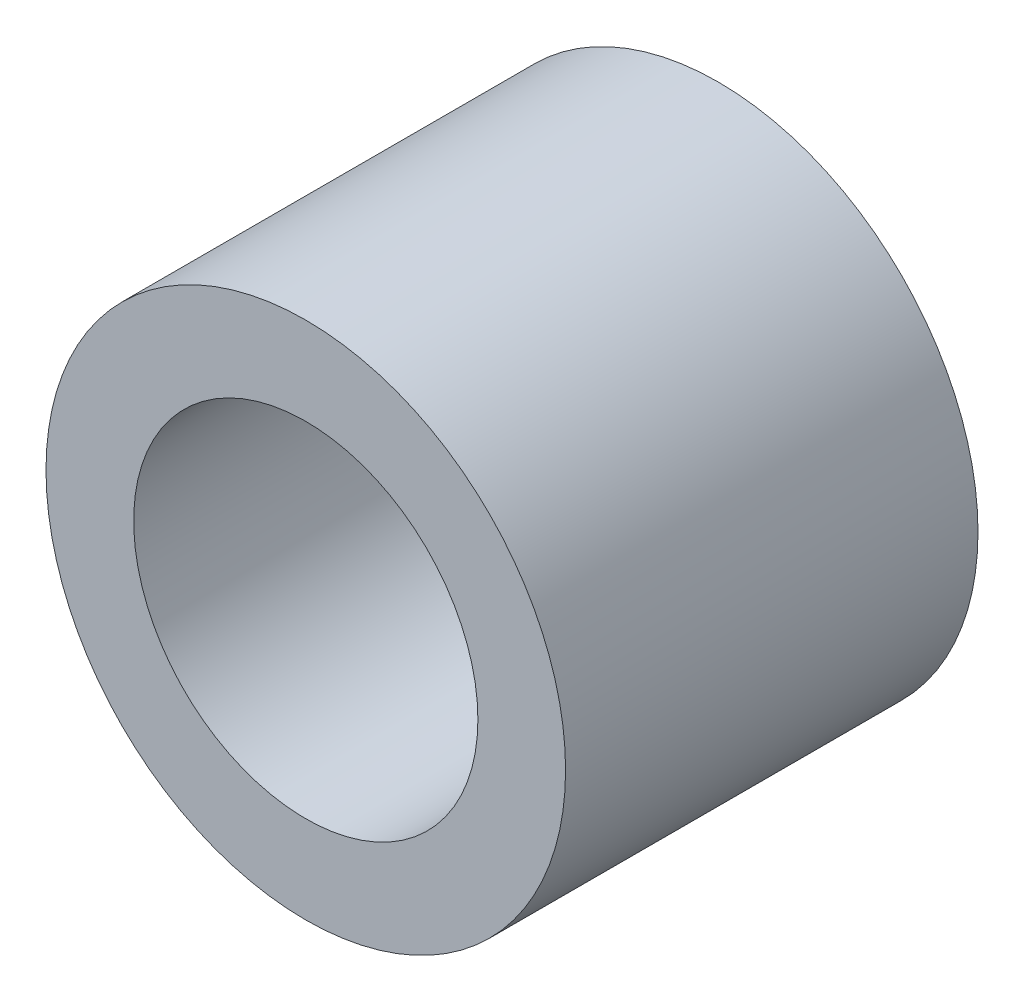
ISO-10303-21;
HEADER;
FILE_DESCRIPTION(('STEP AP214'),'2;1');
FILE_NAME('part.step','',(''),(''),'','','');
FILE_SCHEMA(('AUTOMOTIVE_DESIGN { 1 0 10303 214 1 1 1 1 }'));
ENDSEC;
DATA;
#1=APPLICATION_CONTEXT('core data for automotive mechanical design processes');
#2=APPLICATION_PROTOCOL_DEFINITION('international standard','automotive_design',2000,#1);
#3=PRODUCT_CONTEXT('',#1,'mechanical');
#4=PRODUCT('Part','Part','',(#3));
#5=PRODUCT_RELATED_PRODUCT_CATEGORY('part','',(#4));
#6=PRODUCT_DEFINITION_FORMATION('','',#4);
#7=PRODUCT_DEFINITION_CONTEXT('part definition',#1,'design');
#8=PRODUCT_DEFINITION('design','',#6,#7);
#9=PRODUCT_DEFINITION_SHAPE('','',#8);
#10=(LENGTH_UNIT() NAMED_UNIT(*) SI_UNIT(.MILLI.,.METRE.));
#11=(NAMED_UNIT(*) PLANE_ANGLE_UNIT() SI_UNIT($,.RADIAN.));
#12=(NAMED_UNIT(*) SI_UNIT($,.STERADIAN.) SOLID_ANGLE_UNIT());
#13=UNCERTAINTY_MEASURE_WITH_UNIT(LENGTH_MEASURE(1.E-05),#10,'distance_accuracy_value','');
#14=(GEOMETRIC_REPRESENTATION_CONTEXT(3) GLOBAL_UNCERTAINTY_ASSIGNED_CONTEXT((#13)) GLOBAL_UNIT_ASSIGNED_CONTEXT((#10,
#11,#12)) REPRESENTATION_CONTEXT('',''));
#15=CARTESIAN_POINT('',(0.,0.,0.));
#16=DIRECTION('',(0.,0.,1.));
#17=DIRECTION('',(1.,0.,0.));
#18=AXIS2_PLACEMENT_3D('',#15,#16,#17);
#19=CARTESIAN_POINT('',(0.,0.,3.175));
#20=DIRECTION('',(0.,0.,1.));
#21=DIRECTION('',(1.,0.,0.));
#22=AXIS2_PLACEMENT_3D('',#19,#20,#21);
#23=PLANE('',#22);
#24=CARTESIAN_POINT('',(0.,0.,3.175));
#25=DIRECTION('',(0.,0.,1.));
#26=DIRECTION('',(1.,0.,0.));
#27=AXIS2_PLACEMENT_3D('',#24,#25,#26);
#28=CIRCLE('',#27,4.);
#29=CARTESIAN_POINT('',(4.,0.,3.175));
#30=VERTEX_POINT('',#29);
#31=EDGE_CURVE('E10',#30,#30,#28,.T.);
#32=ORIENTED_EDGE('',*,*,#31,.T.);
#33=EDGE_LOOP('',(#32));
#34=FACE_BOUND('',#33,.T.);
#35=CARTESIAN_POINT('',(0.,0.,3.175));
#36=DIRECTION('',(0.,0.,1.));
#37=DIRECTION('',(1.,0.,0.));
#38=AXIS2_PLACEMENT_3D('',#35,#36,#37);
#39=CIRCLE('',#38,2.65);
#40=CARTESIAN_POINT('',(2.65,0.,3.175));
#41=VERTEX_POINT('',#40);
#42=EDGE_CURVE('E43',#41,#41,#39,.T.);
#43=ORIENTED_EDGE('',*,*,#42,.F.);
#44=EDGE_LOOP('',(#43));
#45=FACE_BOUND('',#44,.T.);
#46=ADVANCED_FACE('F32',(#34,#45),#23,.T.);
#47=CARTESIAN_POINT('',(0.,0.,-3.175));
#48=DIRECTION('',(0.,0.,1.));
#49=DIRECTION('',(1.,0.,0.));
#50=AXIS2_PLACEMENT_3D('',#47,#48,#49);
#51=PLANE('',#50);
#52=CARTESIAN_POINT('',(0.,0.,-3.175));
#53=DIRECTION('',(0.,0.,1.));
#54=DIRECTION('',(1.,0.,0.));
#55=AXIS2_PLACEMENT_3D('',#52,#53,#54);
#56=CIRCLE('',#55,4.);
#57=CARTESIAN_POINT('',(4.,0.,-3.175));
#58=VERTEX_POINT('',#57);
#59=EDGE_CURVE('E36',#58,#58,#56,.T.);
#60=ORIENTED_EDGE('',*,*,#59,.F.);
#61=EDGE_LOOP('',(#60));
#62=FACE_BOUND('',#61,.T.);
#63=CARTESIAN_POINT('',(0.,0.,-3.175));
#64=DIRECTION('',(0.,0.,1.));
#65=DIRECTION('',(1.,0.,0.));
#66=AXIS2_PLACEMENT_3D('',#63,#64,#65);
#67=CIRCLE('',#66,2.65);
#68=CARTESIAN_POINT('',(2.65,0.,-3.175));
#69=VERTEX_POINT('',#68);
#70=EDGE_CURVE('E45',#69,#69,#67,.T.);
#71=ORIENTED_EDGE('',*,*,#70,.T.);
#72=EDGE_LOOP('',(#71));
#73=FACE_BOUND('',#72,.T.);
#74=ADVANCED_FACE('F55',(#62,#73),#51,.F.);
#75=CARTESIAN_POINT('',(0.,0.,3.175));
#76=DIRECTION('',(0.,0.,-1.));
#77=DIRECTION('',(-1.,0.,0.));
#78=AXIS2_PLACEMENT_3D('',#75,#76,#77);
#79=CYLINDRICAL_SURFACE('',#78,4.);
#80=ORIENTED_EDGE('',*,*,#31,.F.);
#81=EDGE_LOOP('',(#80));
#82=FACE_BOUND('',#81,.T.);
#83=ORIENTED_EDGE('',*,*,#59,.T.);
#84=EDGE_LOOP('',(#83));
#85=FACE_BOUND('',#84,.T.);
#86=ADVANCED_FACE('F34',(#82,#85),#79,.T.);
#87=CARTESIAN_POINT('',(0.,0.,3.175));
#88=DIRECTION('',(0.,0.,-1.));
#89=DIRECTION('',(-1.,0.,0.));
#90=AXIS2_PLACEMENT_3D('',#87,#88,#89);
#91=CYLINDRICAL_SURFACE('',#90,2.65);
#92=ORIENTED_EDGE('',*,*,#42,.T.);
#93=EDGE_LOOP('',(#92));
#94=FACE_BOUND('',#93,.T.);
#95=ORIENTED_EDGE('',*,*,#70,.F.);
#96=EDGE_LOOP('',(#95));
#97=FACE_BOUND('',#96,.T.);
#98=ADVANCED_FACE('F51',(#94,#97),#91,.F.);
#99=CLOSED_SHELL('',(#46,#74,#86,#98));
#100=MANIFOLD_SOLID_BREP('B2',#99);
#101=ADVANCED_BREP_SHAPE_REPRESENTATION('',(#18,#100),#14);
#102=SHAPE_DEFINITION_REPRESENTATION(#9,#101);
ENDSEC;
END-ISO-10303-21;
